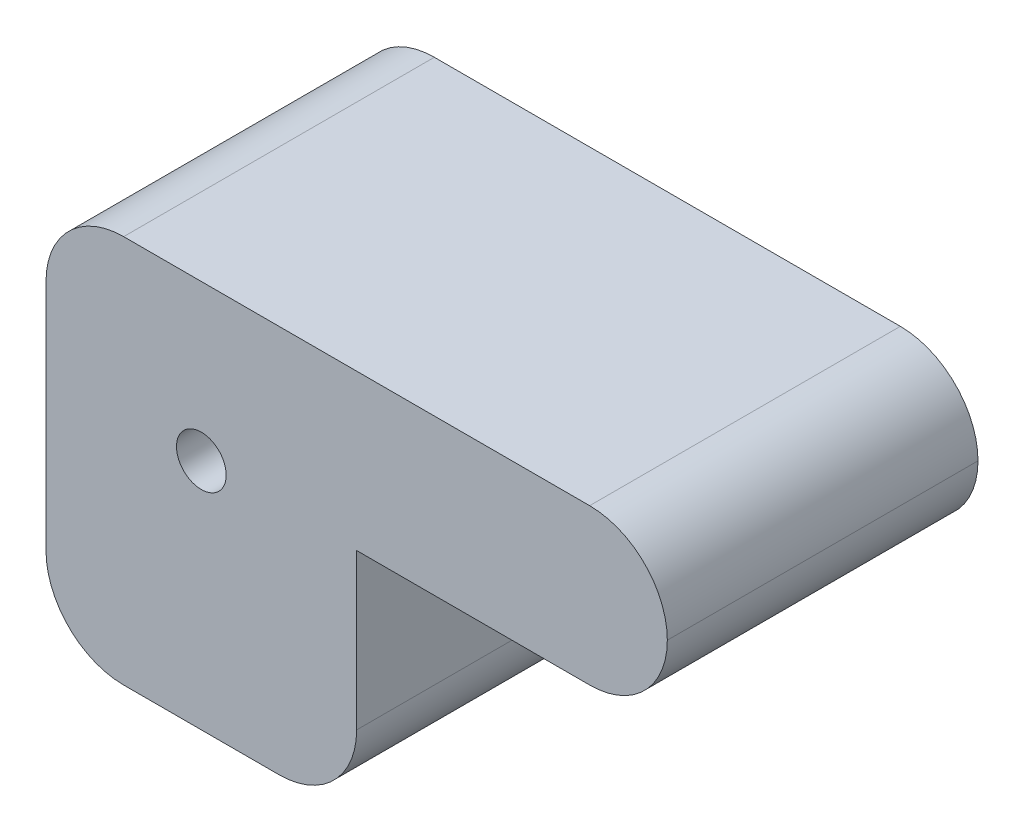
ISO-10303-21;
HEADER;
FILE_DESCRIPTION(('STEP AP214'),'2;1');
FILE_NAME('part.step','',(''),(''),'','','');
FILE_SCHEMA(('AUTOMOTIVE_DESIGN { 1 0 10303 214 1 1 1 1 }'));
ENDSEC;
DATA;
#1=APPLICATION_CONTEXT('core data for automotive mechanical design processes');
#2=APPLICATION_PROTOCOL_DEFINITION('international standard','automotive_design',2000,#1);
#3=PRODUCT_CONTEXT('',#1,'mechanical');
#4=PRODUCT('Part','Part','',(#3));
#5=PRODUCT_RELATED_PRODUCT_CATEGORY('part','',(#4));
#6=PRODUCT_DEFINITION_FORMATION('','',#4);
#7=PRODUCT_DEFINITION_CONTEXT('part definition',#1,'design');
#8=PRODUCT_DEFINITION('design','',#6,#7);
#9=PRODUCT_DEFINITION_SHAPE('','',#8);
#10=(LENGTH_UNIT() NAMED_UNIT(*) SI_UNIT(.MILLI.,.METRE.));
#11=(NAMED_UNIT(*) PLANE_ANGLE_UNIT() SI_UNIT($,.RADIAN.));
#12=(NAMED_UNIT(*) SI_UNIT($,.STERADIAN.) SOLID_ANGLE_UNIT());
#13=UNCERTAINTY_MEASURE_WITH_UNIT(LENGTH_MEASURE(1.E-05),#10,'distance_accuracy_value','');
#14=(GEOMETRIC_REPRESENTATION_CONTEXT(3) GLOBAL_UNCERTAINTY_ASSIGNED_CONTEXT((#13)) GLOBAL_UNIT_ASSIGNED_CONTEXT((#10,
#11,#12)) REPRESENTATION_CONTEXT('',''));
#15=CARTESIAN_POINT('',(0.,0.,0.));
#16=DIRECTION('',(0.,0.,1.));
#17=DIRECTION('',(1.,0.,0.));
#18=AXIS2_PLACEMENT_3D('',#15,#16,#17);
#19=CARTESIAN_POINT('',(0.,10.,20.));
#20=DIRECTION('',(0.,-1.,0.));
#21=DIRECTION('',(1.,0.,0.));
#22=AXIS2_PLACEMENT_3D('',#19,#20,#21);
#23=PLANE('',#22);
#24=DIRECTION('',(-1.,0.,0.));
#25=VECTOR('',#24,1.);
#26=CARTESIAN_POINT('',(0.,10.,20.));
#27=LINE('',#26,#25);
#28=CARTESIAN_POINT('',(-5.,10.,20.));
#29=VERTEX_POINT('',#28);
#30=CARTESIAN_POINT('',(-35.,9.99999999999999,20.));
#31=VERTEX_POINT('',#30);
#32=EDGE_CURVE('E142',#29,#31,#27,.T.);
#33=ORIENTED_EDGE('',*,*,#32,.F.);
#34=DIRECTION('',(0.,0.,-1.));
#35=VECTOR('',#34,1.);
#36=CARTESIAN_POINT('',(-5.,10.,20.));
#37=LINE('',#36,#35);
#38=CARTESIAN_POINT('',(-5.,10.,0.));
#39=VERTEX_POINT('',#38);
#40=EDGE_CURVE('E154',#29,#39,#37,.T.);
#41=ORIENTED_EDGE('',*,*,#40,.T.);
#42=DIRECTION('',(-1.,0.,0.));
#43=VECTOR('',#42,1.);
#44=CARTESIAN_POINT('',(0.,10.,0.));
#45=LINE('',#44,#43);
#46=CARTESIAN_POINT('',(-35.,9.99999999999999,0.));
#47=VERTEX_POINT('',#46);
#48=EDGE_CURVE('E136',#39,#47,#45,.T.);
#49=ORIENTED_EDGE('',*,*,#48,.T.);
#50=DIRECTION('',(0.,0.,-1.));
#51=VECTOR('',#50,1.);
#52=CARTESIAN_POINT('',(-35.,9.99999999999999,20.));
#53=LINE('',#52,#51);
#54=EDGE_CURVE('E152',#47,#31,#53,.F.);
#55=ORIENTED_EDGE('',*,*,#54,.T.);
#56=EDGE_LOOP('',(#33,#41,#49,#55));
#57=FACE_BOUND('',#56,.T.);
#58=ADVANCED_FACE('F41',(#57),#23,.F.);
#59=CARTESIAN_POINT('',(-40.,0.,20.));
#60=DIRECTION('',(1.,0.,0.));
#61=DIRECTION('',(0.,0.,-1.));
#62=AXIS2_PLACEMENT_3D('',#59,#60,#61);
#63=PLANE('',#62);
#64=DIRECTION('',(0.,-1.,0.));
#65=VECTOR('',#64,1.);
#66=CARTESIAN_POINT('',(-40.,0.,0.));
#67=LINE('',#66,#65);
#68=CARTESIAN_POINT('',(-40.,4.99999999999999,0.));
#69=VERTEX_POINT('',#68);
#70=CARTESIAN_POINT('',(-40.,-10.,0.));
#71=VERTEX_POINT('',#70);
#72=EDGE_CURVE('E143',#69,#71,#67,.T.);
#73=ORIENTED_EDGE('',*,*,#72,.T.);
#74=DIRECTION('',(0.,0.,1.));
#75=VECTOR('',#74,1.);
#76=CARTESIAN_POINT('',(-40.,-10.,20.));
#77=LINE('',#76,#75);
#78=CARTESIAN_POINT('',(-40.,-10.,20.));
#79=VERTEX_POINT('',#78);
#80=EDGE_CURVE('E11',#71,#79,#77,.T.);
#81=ORIENTED_EDGE('',*,*,#80,.T.);
#82=DIRECTION('',(0.,-1.,0.));
#83=VECTOR('',#82,1.);
#84=CARTESIAN_POINT('',(-40.,0.,20.));
#85=LINE('',#84,#83);
#86=CARTESIAN_POINT('',(-40.,4.99999999999999,20.));
#87=VERTEX_POINT('',#86);
#88=EDGE_CURVE('E146',#87,#79,#85,.T.);
#89=ORIENTED_EDGE('',*,*,#88,.F.);
#90=DIRECTION('',(0.,0.,-1.));
#91=VECTOR('',#90,1.);
#92=CARTESIAN_POINT('',(-40.,4.99999999999999,20.));
#93=LINE('',#92,#91);
#94=EDGE_CURVE('E50',#87,#69,#93,.T.);
#95=ORIENTED_EDGE('',*,*,#94,.T.);
#96=EDGE_LOOP('',(#73,#81,#89,#95));
#97=FACE_BOUND('',#96,.T.);
#98=ADVANCED_FACE('F187',(#97),#63,.F.);
#99=CARTESIAN_POINT('',(0.,0.,20.));
#100=DIRECTION('',(0.,1.,0.));
#101=DIRECTION('',(-1.,0.,0.));
#102=AXIS2_PLACEMENT_3D('',#99,#100,#101);
#103=PLANE('',#102);
#104=DIRECTION('',(1.,0.,0.));
#105=VECTOR('',#104,1.);
#106=CARTESIAN_POINT('',(0.,0.,0.));
#107=LINE('',#106,#105);
#108=CARTESIAN_POINT('',(-20.,0.,0.));
#109=VERTEX_POINT('',#108);
#110=CARTESIAN_POINT('',(-5.,0.,0.));
#111=VERTEX_POINT('',#110);
#112=EDGE_CURVE('E134',#109,#111,#107,.T.);
#113=ORIENTED_EDGE('',*,*,#112,.T.);
#114=DIRECTION('',(0.,0.,-1.));
#115=VECTOR('',#114,1.);
#116=CARTESIAN_POINT('',(-5.,0.,20.));
#117=LINE('',#116,#115);
#118=CARTESIAN_POINT('',(-5.,0.,20.));
#119=VERTEX_POINT('',#118);
#120=EDGE_CURVE('E65',#111,#119,#117,.F.);
#121=ORIENTED_EDGE('',*,*,#120,.T.);
#122=DIRECTION('',(1.,0.,0.));
#123=VECTOR('',#122,1.);
#124=CARTESIAN_POINT('',(0.,0.,20.));
#125=LINE('',#124,#123);
#126=CARTESIAN_POINT('',(-20.,0.,20.));
#127=VERTEX_POINT('',#126);
#128=EDGE_CURVE('E135',#127,#119,#125,.T.);
#129=ORIENTED_EDGE('',*,*,#128,.F.);
#130=DIRECTION('',(0.,0.,-1.));
#131=VECTOR('',#130,1.);
#132=CARTESIAN_POINT('',(-20.,0.,20.));
#133=LINE('',#132,#131);
#134=EDGE_CURVE('E125',#127,#109,#133,.T.);
#135=ORIENTED_EDGE('',*,*,#134,.T.);
#136=EDGE_LOOP('',(#113,#121,#129,#135));
#137=FACE_BOUND('',#136,.T.);
#138=ADVANCED_FACE('F133',(#137),#103,.F.);
#139=CARTESIAN_POINT('',(0.,0.,20.));
#140=DIRECTION('',(0.,0.,1.));
#141=DIRECTION('',(1.,0.,0.));
#142=AXIS2_PLACEMENT_3D('',#139,#140,#141);
#143=PLANE('',#142);
#144=CARTESIAN_POINT('',(-30.,0.,20.));
#145=DIRECTION('',(0.,0.,1.));
#146=DIRECTION('',(1.,0.,0.));
#147=AXIS2_PLACEMENT_3D('',#144,#145,#146);
#148=CIRCLE('',#147,1.6);
#149=CARTESIAN_POINT('',(-28.4,0.,20.));
#150=VERTEX_POINT('',#149);
#151=EDGE_CURVE('E246',#150,#150,#148,.T.);
#152=ORIENTED_EDGE('',*,*,#151,.F.);
#153=EDGE_LOOP('',(#152));
#154=FACE_BOUND('',#153,.T.);
#155=CARTESIAN_POINT('',(-5.,5.,20.));
#156=DIRECTION('',(0.,0.,1.));
#157=DIRECTION('',(1.,0.,0.));
#158=AXIS2_PLACEMENT_3D('',#155,#156,#157);
#159=CIRCLE('',#158,5.);
#160=CARTESIAN_POINT('',(0.,5.,20.));
#161=VERTEX_POINT('',#160);
#162=EDGE_CURVE('E57',#119,#161,#159,.T.);
#163=ORIENTED_EDGE('',*,*,#162,.T.);
#164=CARTESIAN_POINT('',(-5.,5.,20.));
#165=DIRECTION('',(0.,0.,1.));
#166=DIRECTION('',(1.,0.,0.));
#167=AXIS2_PLACEMENT_3D('',#164,#165,#166);
#168=CIRCLE('',#167,5.);
#169=EDGE_CURVE('E173',#161,#29,#168,.T.);
#170=ORIENTED_EDGE('',*,*,#169,.T.);
#171=ORIENTED_EDGE('',*,*,#32,.T.);
#172=CARTESIAN_POINT('',(-35.,4.99999999999999,20.));
#173=DIRECTION('',(0.,0.,1.));
#174=DIRECTION('',(1.,0.,0.));
#175=AXIS2_PLACEMENT_3D('',#172,#173,#174);
#176=CIRCLE('',#175,5.);
#177=EDGE_CURVE('E166',#31,#87,#176,.T.);
#178=ORIENTED_EDGE('',*,*,#177,.T.);
#179=ORIENTED_EDGE('',*,*,#88,.T.);
#180=CARTESIAN_POINT('',(-35.,-10.,20.));
#181=DIRECTION('',(0.,0.,1.));
#182=DIRECTION('',(1.,0.,0.));
#183=AXIS2_PLACEMENT_3D('',#180,#181,#182);
#184=CIRCLE('',#183,5.);
#185=CARTESIAN_POINT('',(-35.,-15.,20.));
#186=VERTEX_POINT('',#185);
#187=EDGE_CURVE('E168',#79,#186,#184,.T.);
#188=ORIENTED_EDGE('',*,*,#187,.T.);
#189=DIRECTION('',(1.,0.,0.));
#190=VECTOR('',#189,1.);
#191=CARTESIAN_POINT('',(-40.,-15.,20.));
#192=LINE('',#191,#190);
#193=CARTESIAN_POINT('',(-25.,-15.,20.));
#194=VERTEX_POINT('',#193);
#195=EDGE_CURVE('E243',#186,#194,#192,.T.);
#196=ORIENTED_EDGE('',*,*,#195,.T.);
#197=CARTESIAN_POINT('',(-25.,-10.,20.));
#198=DIRECTION('',(0.,0.,1.));
#199=DIRECTION('',(1.,0.,0.));
#200=AXIS2_PLACEMENT_3D('',#197,#198,#199);
#201=CIRCLE('',#200,5.);
#202=CARTESIAN_POINT('',(-20.,-10.,20.));
#203=VERTEX_POINT('',#202);
#204=EDGE_CURVE('E170',#194,#203,#201,.T.);
#205=ORIENTED_EDGE('',*,*,#204,.T.);
#206=DIRECTION('',(0.,1.,0.));
#207=VECTOR('',#206,1.);
#208=CARTESIAN_POINT('',(-20.,9.99999999999999,20.));
#209=LINE('',#208,#207);
#210=EDGE_CURVE('E241',#203,#127,#209,.T.);
#211=ORIENTED_EDGE('',*,*,#210,.T.);
#212=ORIENTED_EDGE('',*,*,#128,.T.);
#213=EDGE_LOOP('',(#163,#170,#171,#178,#179,#188,#196,#205,#211,#212));
#214=FACE_BOUND('',#213,.T.);
#215=ADVANCED_FACE('F199',(#154,#214),#143,.T.);
#216=CARTESIAN_POINT('',(0.,0.,0.));
#217=DIRECTION('',(0.,0.,1.));
#218=DIRECTION('',(1.,0.,0.));
#219=AXIS2_PLACEMENT_3D('',#216,#217,#218);
#220=PLANE('',#219);
#221=CARTESIAN_POINT('',(-30.,0.,0.));
#222=DIRECTION('',(0.,0.,1.));
#223=DIRECTION('',(1.,0.,0.));
#224=AXIS2_PLACEMENT_3D('',#221,#222,#223);
#225=CIRCLE('',#224,1.6);
#226=CARTESIAN_POINT('',(-28.4,0.,0.));
#227=VERTEX_POINT('',#226);
#228=EDGE_CURVE('E250',#227,#227,#225,.T.);
#229=ORIENTED_EDGE('',*,*,#228,.T.);
#230=EDGE_LOOP('',(#229));
#231=FACE_BOUND('',#230,.T.);
#232=ORIENTED_EDGE('',*,*,#48,.F.);
#233=CARTESIAN_POINT('',(-5.,5.,0.));
#234=DIRECTION('',(0.,0.,1.));
#235=DIRECTION('',(1.,0.,0.));
#236=AXIS2_PLACEMENT_3D('',#233,#234,#235);
#237=CIRCLE('',#236,5.);
#238=CARTESIAN_POINT('',(0.,5.,0.));
#239=VERTEX_POINT('',#238);
#240=EDGE_CURVE('E164',#39,#239,#237,.F.);
#241=ORIENTED_EDGE('',*,*,#240,.T.);
#242=CARTESIAN_POINT('',(-5.,5.,0.));
#243=DIRECTION('',(0.,0.,1.));
#244=DIRECTION('',(1.,0.,0.));
#245=AXIS2_PLACEMENT_3D('',#242,#243,#244);
#246=CIRCLE('',#245,5.);
#247=EDGE_CURVE('E141',#239,#111,#246,.F.);
#248=ORIENTED_EDGE('',*,*,#247,.T.);
#249=ORIENTED_EDGE('',*,*,#112,.F.);
#250=DIRECTION('',(0.,1.,0.));
#251=VECTOR('',#250,1.);
#252=CARTESIAN_POINT('',(-20.,9.99999999999999,0.));
#253=LINE('',#252,#251);
#254=CARTESIAN_POINT('',(-20.,-10.,0.));
#255=VERTEX_POINT('',#254);
#256=EDGE_CURVE('E121',#255,#109,#253,.T.);
#257=ORIENTED_EDGE('',*,*,#256,.F.);
#258=CARTESIAN_POINT('',(-25.,-10.,0.));
#259=DIRECTION('',(0.,0.,1.));
#260=DIRECTION('',(1.,0.,0.));
#261=AXIS2_PLACEMENT_3D('',#258,#259,#260);
#262=CIRCLE('',#261,5.);
#263=CARTESIAN_POINT('',(-25.,-15.,0.));
#264=VERTEX_POINT('',#263);
#265=EDGE_CURVE('E161',#255,#264,#262,.F.);
#266=ORIENTED_EDGE('',*,*,#265,.T.);
#267=DIRECTION('',(1.,0.,0.));
#268=VECTOR('',#267,1.);
#269=CARTESIAN_POINT('',(-40.,-15.,0.));
#270=LINE('',#269,#268);
#271=CARTESIAN_POINT('',(-35.,-15.,0.));
#272=VERTEX_POINT('',#271);
#273=EDGE_CURVE('E131',#272,#264,#270,.T.);
#274=ORIENTED_EDGE('',*,*,#273,.F.);
#275=CARTESIAN_POINT('',(-35.,-10.,0.));
#276=DIRECTION('',(0.,0.,1.));
#277=DIRECTION('',(1.,0.,0.));
#278=AXIS2_PLACEMENT_3D('',#275,#276,#277);
#279=CIRCLE('',#278,5.);
#280=EDGE_CURVE('E159',#272,#71,#279,.F.);
#281=ORIENTED_EDGE('',*,*,#280,.T.);
#282=ORIENTED_EDGE('',*,*,#72,.F.);
#283=CARTESIAN_POINT('',(-35.,4.99999999999999,0.));
#284=DIRECTION('',(0.,0.,1.));
#285=DIRECTION('',(1.,0.,0.));
#286=AXIS2_PLACEMENT_3D('',#283,#284,#285);
#287=CIRCLE('',#286,5.);
#288=EDGE_CURVE('E157',#69,#47,#287,.F.);
#289=ORIENTED_EDGE('',*,*,#288,.T.);
#290=EDGE_LOOP('',(#232,#241,#248,#249,#257,#266,#274,#281,#282,#289));
#291=FACE_BOUND('',#290,.T.);
#292=ADVANCED_FACE('F139',(#231,#291),#220,.F.);
#293=CARTESIAN_POINT('',(-20.,9.99999999999999,0.));
#294=DIRECTION('',(1.,0.,0.));
#295=DIRECTION('',(0.,1.,0.));
#296=AXIS2_PLACEMENT_3D('',#293,#294,#295);
#297=PLANE('',#296);
#298=ORIENTED_EDGE('',*,*,#210,.F.);
#299=DIRECTION('',(0.,0.,1.));
#300=VECTOR('',#299,1.);
#301=CARTESIAN_POINT('',(-20.,-10.,0.));
#302=LINE('',#301,#300);
#303=EDGE_CURVE('E127',#203,#255,#302,.F.);
#304=ORIENTED_EDGE('',*,*,#303,.T.);
#305=ORIENTED_EDGE('',*,*,#256,.T.);
#306=ORIENTED_EDGE('',*,*,#134,.F.);
#307=EDGE_LOOP('',(#298,#304,#305,#306));
#308=FACE_BOUND('',#307,.T.);
#309=ADVANCED_FACE('F124',(#308),#297,.T.);
#310=CARTESIAN_POINT('',(-40.,-15.,0.));
#311=DIRECTION('',(0.,-1.,0.));
#312=DIRECTION('',(0.,0.,-1.));
#313=AXIS2_PLACEMENT_3D('',#310,#311,#312);
#314=PLANE('',#313);
#315=ORIENTED_EDGE('',*,*,#273,.T.);
#316=DIRECTION('',(0.,0.,1.));
#317=VECTOR('',#316,1.);
#318=CARTESIAN_POINT('',(-25.,-15.,0.));
#319=LINE('',#318,#317);
#320=EDGE_CURVE('E178',#264,#194,#319,.T.);
#321=ORIENTED_EDGE('',*,*,#320,.T.);
#322=ORIENTED_EDGE('',*,*,#195,.F.);
#323=DIRECTION('',(0.,0.,1.));
#324=VECTOR('',#323,1.);
#325=CARTESIAN_POINT('',(-35.,-15.,0.));
#326=LINE('',#325,#324);
#327=EDGE_CURVE('E176',#186,#272,#326,.F.);
#328=ORIENTED_EDGE('',*,*,#327,.T.);
#329=EDGE_LOOP('',(#315,#321,#322,#328));
#330=FACE_BOUND('',#329,.T.);
#331=ADVANCED_FACE('F233',(#330),#314,.T.);
#332=CARTESIAN_POINT('',(-5.,5.,20.));
#333=DIRECTION('',(0.,0.,-1.));
#334=DIRECTION('',(-1.,0.,0.));
#335=AXIS2_PLACEMENT_3D('',#332,#333,#334);
#336=CYLINDRICAL_SURFACE('',#335,5.);
#337=DIRECTION('',(0.,0.,-1.));
#338=VECTOR('',#337,1.);
#339=CARTESIAN_POINT('',(0.,5.,20.));
#340=LINE('',#339,#338);
#341=EDGE_CURVE('E45',#161,#239,#340,.T.);
#342=ORIENTED_EDGE('',*,*,#341,.F.);
#343=ORIENTED_EDGE('',*,*,#162,.F.);
#344=ORIENTED_EDGE('',*,*,#120,.F.);
#345=ORIENTED_EDGE('',*,*,#247,.F.);
#346=EDGE_LOOP('',(#342,#343,#344,#345));
#347=FACE_BOUND('',#346,.T.);
#348=ADVANCED_FACE('F229',(#347),#336,.T.);
#349=CARTESIAN_POINT('',(-5.,5.,20.));
#350=DIRECTION('',(0.,0.,-1.));
#351=DIRECTION('',(-1.,0.,0.));
#352=AXIS2_PLACEMENT_3D('',#349,#350,#351);
#353=CYLINDRICAL_SURFACE('',#352,5.);
#354=ORIENTED_EDGE('',*,*,#169,.F.);
#355=ORIENTED_EDGE('',*,*,#341,.T.);
#356=ORIENTED_EDGE('',*,*,#240,.F.);
#357=ORIENTED_EDGE('',*,*,#40,.F.);
#358=EDGE_LOOP('',(#354,#355,#356,#357));
#359=FACE_BOUND('',#358,.T.);
#360=ADVANCED_FACE('F226',(#359),#353,.T.);
#361=CARTESIAN_POINT('',(-25.,-10.,0.));
#362=DIRECTION('',(0.,0.,1.));
#363=DIRECTION('',(1.,0.,0.));
#364=AXIS2_PLACEMENT_3D('',#361,#362,#363);
#365=CYLINDRICAL_SURFACE('',#364,5.);
#366=ORIENTED_EDGE('',*,*,#265,.F.);
#367=ORIENTED_EDGE('',*,*,#303,.F.);
#368=ORIENTED_EDGE('',*,*,#204,.F.);
#369=ORIENTED_EDGE('',*,*,#320,.F.);
#370=EDGE_LOOP('',(#366,#367,#368,#369));
#371=FACE_BOUND('',#370,.T.);
#372=ADVANCED_FACE('F217',(#371),#365,.T.);
#373=CARTESIAN_POINT('',(-35.,-10.,20.));
#374=DIRECTION('',(0.,0.,-1.));
#375=DIRECTION('',(-1.,0.,0.));
#376=AXIS2_PLACEMENT_3D('',#373,#374,#375);
#377=CYLINDRICAL_SURFACE('',#376,5.);
#378=ORIENTED_EDGE('',*,*,#280,.F.);
#379=ORIENTED_EDGE('',*,*,#327,.F.);
#380=ORIENTED_EDGE('',*,*,#187,.F.);
#381=ORIENTED_EDGE('',*,*,#80,.F.);
#382=EDGE_LOOP('',(#378,#379,#380,#381));
#383=FACE_BOUND('',#382,.T.);
#384=ADVANCED_FACE('F198',(#383),#377,.T.);
#385=CARTESIAN_POINT('',(-35.,4.99999999999999,20.));
#386=DIRECTION('',(0.,0.,-1.));
#387=DIRECTION('',(-1.,0.,0.));
#388=AXIS2_PLACEMENT_3D('',#385,#386,#387);
#389=CYLINDRICAL_SURFACE('',#388,5.);
#390=ORIENTED_EDGE('',*,*,#177,.F.);
#391=ORIENTED_EDGE('',*,*,#54,.F.);
#392=ORIENTED_EDGE('',*,*,#288,.F.);
#393=ORIENTED_EDGE('',*,*,#94,.F.);
#394=EDGE_LOOP('',(#390,#391,#392,#393));
#395=FACE_BOUND('',#394,.T.);
#396=ADVANCED_FACE('F43',(#395),#389,.T.);
#397=CARTESIAN_POINT('',(-30.,0.,0.));
#398=DIRECTION('',(0.,0.,1.));
#399=DIRECTION('',(1.,0.,0.));
#400=AXIS2_PLACEMENT_3D('',#397,#398,#399);
#401=CYLINDRICAL_SURFACE('',#400,1.6);
#402=ORIENTED_EDGE('',*,*,#228,.F.);
#403=EDGE_LOOP('',(#402));
#404=FACE_BOUND('',#403,.T.);
#405=ORIENTED_EDGE('',*,*,#151,.T.);
#406=EDGE_LOOP('',(#405));
#407=FACE_BOUND('',#406,.T.);
#408=ADVANCED_FACE('F209',(#404,#407),#401,.F.);
#409=CLOSED_SHELL('',(#58,#98,#138,#215,#292,#309,#331,#348,#360,#372,#384,#396,#408));
#410=MANIFOLD_SOLID_BREP('B2',#409);
#411=ADVANCED_BREP_SHAPE_REPRESENTATION('',(#18,#410),#14);
#412=SHAPE_DEFINITION_REPRESENTATION(#9,#411);
ENDSEC;
END-ISO-10303-21;
